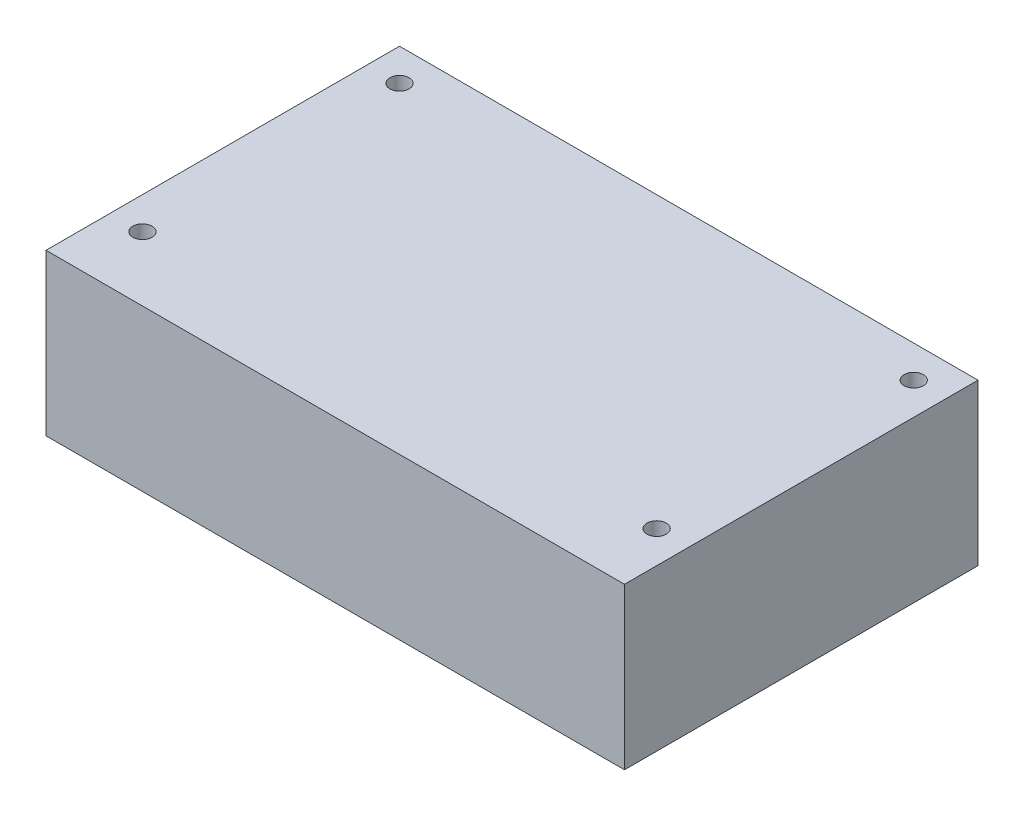
ISO-10303-21;
HEADER;
FILE_DESCRIPTION(('STEP AP214'),'2;1');
FILE_NAME('part.step','',(''),(''),'','','');
FILE_SCHEMA(('AUTOMOTIVE_DESIGN { 1 0 10303 214 1 1 1 1 }'));
ENDSEC;
DATA;
#1=APPLICATION_CONTEXT('core data for automotive mechanical design processes');
#2=APPLICATION_PROTOCOL_DEFINITION('international standard','automotive_design',2000,#1);
#3=PRODUCT_CONTEXT('',#1,'mechanical');
#4=PRODUCT('Part','Part','',(#3));
#5=PRODUCT_RELATED_PRODUCT_CATEGORY('part','',(#4));
#6=PRODUCT_DEFINITION_FORMATION('','',#4);
#7=PRODUCT_DEFINITION_CONTEXT('part definition',#1,'design');
#8=PRODUCT_DEFINITION('design','',#6,#7);
#9=PRODUCT_DEFINITION_SHAPE('','',#8);
#10=(LENGTH_UNIT() NAMED_UNIT(*) SI_UNIT(.MILLI.,.METRE.));
#11=(NAMED_UNIT(*) PLANE_ANGLE_UNIT() SI_UNIT($,.RADIAN.));
#12=(NAMED_UNIT(*) SI_UNIT($,.STERADIAN.) SOLID_ANGLE_UNIT());
#13=UNCERTAINTY_MEASURE_WITH_UNIT(LENGTH_MEASURE(1.E-05),#10,'distance_accuracy_value','');
#14=(GEOMETRIC_REPRESENTATION_CONTEXT(3) GLOBAL_UNCERTAINTY_ASSIGNED_CONTEXT((#13)) GLOBAL_UNIT_ASSIGNED_CONTEXT((#10,
#11,#12)) REPRESENTATION_CONTEXT('',''));
#15=CARTESIAN_POINT('',(0.,0.,0.));
#16=DIRECTION('',(0.,0.,1.));
#17=DIRECTION('',(1.,0.,0.));
#18=AXIS2_PLACEMENT_3D('',#15,#16,#17);
#19=CARTESIAN_POINT('',(0.,25.,0.));
#20=DIRECTION('',(0.,-1.,0.));
#21=DIRECTION('',(0.,0.,-1.));
#22=AXIS2_PLACEMENT_3D('',#19,#20,#21);
#23=PLANE('',#22);
#24=DIRECTION('',(0.,0.,-1.));
#25=VECTOR('',#24,1.);
#26=CARTESIAN_POINT('',(45.,25.,27.5));
#27=LINE('',#26,#25);
#28=CARTESIAN_POINT('',(45.,25.,27.5));
#29=VERTEX_POINT('',#28);
#30=CARTESIAN_POINT('',(45.,25.,-27.5));
#31=VERTEX_POINT('',#30);
#32=EDGE_CURVE('E96',#29,#31,#27,.T.);
#33=ORIENTED_EDGE('',*,*,#32,.T.);
#34=DIRECTION('',(-1.,0.,0.));
#35=VECTOR('',#34,1.);
#36=CARTESIAN_POINT('',(-45.,25.,-27.5));
#37=LINE('',#36,#35);
#38=CARTESIAN_POINT('',(-45.,25.,-27.5));
#39=VERTEX_POINT('',#38);
#40=EDGE_CURVE('E91',#31,#39,#37,.T.);
#41=ORIENTED_EDGE('',*,*,#40,.T.);
#42=DIRECTION('',(0.,0.,1.));
#43=VECTOR('',#42,1.);
#44=CARTESIAN_POINT('',(-45.,25.,27.5));
#45=LINE('',#44,#43);
#46=CARTESIAN_POINT('',(-45.,25.,27.5));
#47=VERTEX_POINT('',#46);
#48=EDGE_CURVE('E94',#39,#47,#45,.T.);
#49=ORIENTED_EDGE('',*,*,#48,.T.);
#50=DIRECTION('',(1.,0.,0.));
#51=VECTOR('',#50,1.);
#52=CARTESIAN_POINT('',(-45.,25.,27.5));
#53=LINE('',#52,#51);
#54=EDGE_CURVE('E61',#47,#29,#53,.T.);
#55=ORIENTED_EDGE('',*,*,#54,.T.);
#56=EDGE_LOOP('',(#33,#41,#49,#55));
#57=FACE_BOUND('',#56,.T.);
#58=CARTESIAN_POINT('',(-40.,25.,-22.5));
#59=DIRECTION('',(0.,1.,0.));
#60=DIRECTION('',(0.,0.,1.));
#61=AXIS2_PLACEMENT_3D('',#58,#59,#60);
#62=CIRCLE('',#61,1.5);
#63=CARTESIAN_POINT('',(-40.,25.,-21.));
#64=VERTEX_POINT('',#63);
#65=EDGE_CURVE('E116',#64,#64,#62,.T.);
#66=ORIENTED_EDGE('',*,*,#65,.F.);
#67=EDGE_LOOP('',(#66));
#68=FACE_BOUND('',#67,.T.);
#69=CARTESIAN_POINT('',(40.,25.,-22.5));
#70=DIRECTION('',(0.,1.,0.));
#71=DIRECTION('',(0.,0.,1.));
#72=AXIS2_PLACEMENT_3D('',#69,#70,#71);
#73=CIRCLE('',#72,1.5);
#74=CARTESIAN_POINT('',(40.,25.,-21.));
#75=VERTEX_POINT('',#74);
#76=EDGE_CURVE('E138',#75,#75,#73,.T.);
#77=ORIENTED_EDGE('',*,*,#76,.F.);
#78=EDGE_LOOP('',(#77));
#79=FACE_BOUND('',#78,.T.);
#80=CARTESIAN_POINT('',(40.,25.,17.5));
#81=DIRECTION('',(0.,1.,0.));
#82=DIRECTION('',(0.,0.,1.));
#83=AXIS2_PLACEMENT_3D('',#80,#81,#82);
#84=CIRCLE('',#83,1.5);
#85=CARTESIAN_POINT('',(40.,25.,19.));
#86=VERTEX_POINT('',#85);
#87=EDGE_CURVE('E146',#86,#86,#84,.T.);
#88=ORIENTED_EDGE('',*,*,#87,.F.);
#89=EDGE_LOOP('',(#88));
#90=FACE_BOUND('',#89,.T.);
#91=CARTESIAN_POINT('',(-40.,25.,17.5));
#92=DIRECTION('',(0.,1.,0.));
#93=DIRECTION('',(0.,0.,1.));
#94=AXIS2_PLACEMENT_3D('',#91,#92,#93);
#95=CIRCLE('',#94,1.5);
#96=CARTESIAN_POINT('',(-40.,25.,19.));
#97=VERTEX_POINT('',#96);
#98=EDGE_CURVE('E154',#97,#97,#95,.T.);
#99=ORIENTED_EDGE('',*,*,#98,.F.);
#100=EDGE_LOOP('',(#99));
#101=FACE_BOUND('',#100,.T.);
#102=ADVANCED_FACE('F43',(#57,#68,#79,#90,#101),#23,.F.);
#103=CARTESIAN_POINT('',(0.,0.,0.));
#104=DIRECTION('',(0.,-1.,0.));
#105=DIRECTION('',(0.,0.,-1.));
#106=AXIS2_PLACEMENT_3D('',#103,#104,#105);
#107=PLANE('',#106);
#108=CARTESIAN_POINT('',(40.,0.,17.5));
#109=DIRECTION('',(0.,1.,0.));
#110=DIRECTION('',(0.,0.,1.));
#111=AXIS2_PLACEMENT_3D('',#108,#109,#110);
#112=CIRCLE('',#111,1.5);
#113=CARTESIAN_POINT('',(40.,0.,19.));
#114=VERTEX_POINT('',#113);
#115=EDGE_CURVE('E150',#114,#114,#112,.T.);
#116=ORIENTED_EDGE('',*,*,#115,.T.);
#117=EDGE_LOOP('',(#116));
#118=FACE_BOUND('',#117,.T.);
#119=CARTESIAN_POINT('',(-40.,0.,-22.5));
#120=DIRECTION('',(0.,1.,0.));
#121=DIRECTION('',(0.,0.,1.));
#122=AXIS2_PLACEMENT_3D('',#119,#120,#121);
#123=CIRCLE('',#122,1.5);
#124=CARTESIAN_POINT('',(-40.,0.,-21.));
#125=VERTEX_POINT('',#124);
#126=EDGE_CURVE('E134',#125,#125,#123,.T.);
#127=ORIENTED_EDGE('',*,*,#126,.T.);
#128=EDGE_LOOP('',(#127));
#129=FACE_BOUND('',#128,.T.);
#130=DIRECTION('',(0.,0.,-1.));
#131=VECTOR('',#130,1.);
#132=CARTESIAN_POINT('',(45.,0.,27.5));
#133=LINE('',#132,#131);
#134=CARTESIAN_POINT('',(45.,0.,27.5));
#135=VERTEX_POINT('',#134);
#136=CARTESIAN_POINT('',(45.,0.,-27.5));
#137=VERTEX_POINT('',#136);
#138=EDGE_CURVE('E112',#135,#137,#133,.T.);
#139=ORIENTED_EDGE('',*,*,#138,.F.);
#140=DIRECTION('',(1.,0.,0.));
#141=VECTOR('',#140,1.);
#142=CARTESIAN_POINT('',(-45.,0.,27.5));
#143=LINE('',#142,#141);
#144=CARTESIAN_POINT('',(-45.,0.,27.5));
#145=VERTEX_POINT('',#144);
#146=EDGE_CURVE('E84',#145,#135,#143,.T.);
#147=ORIENTED_EDGE('',*,*,#146,.F.);
#148=DIRECTION('',(0.,0.,1.));
#149=VECTOR('',#148,1.);
#150=CARTESIAN_POINT('',(-45.,0.,27.5));
#151=LINE('',#150,#149);
#152=CARTESIAN_POINT('',(-45.,0.,-27.5));
#153=VERTEX_POINT('',#152);
#154=EDGE_CURVE('E78',#153,#145,#151,.T.);
#155=ORIENTED_EDGE('',*,*,#154,.F.);
#156=DIRECTION('',(-1.,0.,0.));
#157=VECTOR('',#156,1.);
#158=CARTESIAN_POINT('',(-45.,0.,-27.5));
#159=LINE('',#158,#157);
#160=EDGE_CURVE('E101',#137,#153,#159,.T.);
#161=ORIENTED_EDGE('',*,*,#160,.F.);
#162=EDGE_LOOP('',(#139,#147,#155,#161));
#163=FACE_BOUND('',#162,.T.);
#164=CARTESIAN_POINT('',(40.,0.,-22.5));
#165=DIRECTION('',(0.,1.,0.));
#166=DIRECTION('',(0.,0.,1.));
#167=AXIS2_PLACEMENT_3D('',#164,#165,#166);
#168=CIRCLE('',#167,1.5);
#169=CARTESIAN_POINT('',(40.,0.,-21.));
#170=VERTEX_POINT('',#169);
#171=EDGE_CURVE('E142',#170,#170,#168,.T.);
#172=ORIENTED_EDGE('',*,*,#171,.T.);
#173=EDGE_LOOP('',(#172));
#174=FACE_BOUND('',#173,.T.);
#175=CARTESIAN_POINT('',(-40.,0.,17.5));
#176=DIRECTION('',(0.,1.,0.));
#177=DIRECTION('',(0.,0.,1.));
#178=AXIS2_PLACEMENT_3D('',#175,#176,#177);
#179=CIRCLE('',#178,1.5);
#180=CARTESIAN_POINT('',(-40.,0.,19.));
#181=VERTEX_POINT('',#180);
#182=EDGE_CURVE('E158',#181,#181,#179,.T.);
#183=ORIENTED_EDGE('',*,*,#182,.T.);
#184=EDGE_LOOP('',(#183));
#185=FACE_BOUND('',#184,.T.);
#186=ADVANCED_FACE('F129',(#118,#129,#163,#174,#185),#107,.T.);
#187=CARTESIAN_POINT('',(45.,25.,27.5));
#188=DIRECTION('',(-1.,0.,0.));
#189=DIRECTION('',(0.,0.,1.));
#190=AXIS2_PLACEMENT_3D('',#187,#188,#189);
#191=PLANE('',#190);
#192=ORIENTED_EDGE('',*,*,#138,.T.);
#193=DIRECTION('',(0.,-1.,0.));
#194=VECTOR('',#193,1.);
#195=CARTESIAN_POINT('',(45.,25.,-27.5));
#196=LINE('',#195,#194);
#197=EDGE_CURVE('E11',#31,#137,#196,.T.);
#198=ORIENTED_EDGE('',*,*,#197,.F.);
#199=ORIENTED_EDGE('',*,*,#32,.F.);
#200=DIRECTION('',(0.,-1.,0.));
#201=VECTOR('',#200,1.);
#202=CARTESIAN_POINT('',(45.,25.,27.5));
#203=LINE('',#202,#201);
#204=EDGE_CURVE('E108',#29,#135,#203,.T.);
#205=ORIENTED_EDGE('',*,*,#204,.T.);
#206=EDGE_LOOP('',(#192,#198,#199,#205));
#207=FACE_BOUND('',#206,.T.);
#208=ADVANCED_FACE('F45',(#207),#191,.F.);
#209=CARTESIAN_POINT('',(-45.,25.,-27.5));
#210=DIRECTION('',(0.,0.,1.));
#211=DIRECTION('',(1.,0.,0.));
#212=AXIS2_PLACEMENT_3D('',#209,#210,#211);
#213=PLANE('',#212);
#214=ORIENTED_EDGE('',*,*,#160,.T.);
#215=DIRECTION('',(0.,-1.,0.));
#216=VECTOR('',#215,1.);
#217=CARTESIAN_POINT('',(-45.,25.,-27.5));
#218=LINE('',#217,#216);
#219=EDGE_CURVE('E53',#39,#153,#218,.T.);
#220=ORIENTED_EDGE('',*,*,#219,.F.);
#221=ORIENTED_EDGE('',*,*,#40,.F.);
#222=ORIENTED_EDGE('',*,*,#197,.T.);
#223=EDGE_LOOP('',(#214,#220,#221,#222));
#224=FACE_BOUND('',#223,.T.);
#225=ADVANCED_FACE('F100',(#224),#213,.F.);
#226=CARTESIAN_POINT('',(-45.,25.,27.5));
#227=DIRECTION('',(1.,0.,0.));
#228=DIRECTION('',(0.,0.,-1.));
#229=AXIS2_PLACEMENT_3D('',#226,#227,#228);
#230=PLANE('',#229);
#231=ORIENTED_EDGE('',*,*,#154,.T.);
#232=DIRECTION('',(0.,-1.,0.));
#233=VECTOR('',#232,1.);
#234=CARTESIAN_POINT('',(-45.,25.,27.5));
#235=LINE('',#234,#233);
#236=EDGE_CURVE('E103',#47,#145,#235,.T.);
#237=ORIENTED_EDGE('',*,*,#236,.F.);
#238=ORIENTED_EDGE('',*,*,#48,.F.);
#239=ORIENTED_EDGE('',*,*,#219,.T.);
#240=EDGE_LOOP('',(#231,#237,#238,#239));
#241=FACE_BOUND('',#240,.T.);
#242=ADVANCED_FACE('F104',(#241),#230,.F.);
#243=CARTESIAN_POINT('',(-45.,25.,27.5));
#244=DIRECTION('',(0.,0.,-1.));
#245=DIRECTION('',(-1.,0.,0.));
#246=AXIS2_PLACEMENT_3D('',#243,#244,#245);
#247=PLANE('',#246);
#248=ORIENTED_EDGE('',*,*,#146,.T.);
#249=ORIENTED_EDGE('',*,*,#204,.F.);
#250=ORIENTED_EDGE('',*,*,#54,.F.);
#251=ORIENTED_EDGE('',*,*,#236,.T.);
#252=EDGE_LOOP('',(#248,#249,#250,#251));
#253=FACE_BOUND('',#252,.T.);
#254=ADVANCED_FACE('F126',(#253),#247,.F.);
#255=CARTESIAN_POINT('',(-40.,25.,-22.5));
#256=DIRECTION('',(0.,-1.,0.));
#257=DIRECTION('',(0.,0.,-1.));
#258=AXIS2_PLACEMENT_3D('',#255,#256,#257);
#259=CYLINDRICAL_SURFACE('',#258,1.5);
#260=ORIENTED_EDGE('',*,*,#65,.T.);
#261=EDGE_LOOP('',(#260));
#262=FACE_BOUND('',#261,.T.);
#263=ORIENTED_EDGE('',*,*,#126,.F.);
#264=EDGE_LOOP('',(#263));
#265=FACE_BOUND('',#264,.T.);
#266=ADVANCED_FACE('F177',(#262,#265),#259,.F.);
#267=CARTESIAN_POINT('',(40.,25.,-22.5));
#268=DIRECTION('',(0.,-1.,0.));
#269=DIRECTION('',(0.,0.,-1.));
#270=AXIS2_PLACEMENT_3D('',#267,#268,#269);
#271=CYLINDRICAL_SURFACE('',#270,1.5);
#272=ORIENTED_EDGE('',*,*,#76,.T.);
#273=EDGE_LOOP('',(#272));
#274=FACE_BOUND('',#273,.T.);
#275=ORIENTED_EDGE('',*,*,#171,.F.);
#276=EDGE_LOOP('',(#275));
#277=FACE_BOUND('',#276,.T.);
#278=ADVANCED_FACE('F231',(#274,#277),#271,.F.);
#279=CARTESIAN_POINT('',(40.,25.,17.5));
#280=DIRECTION('',(0.,-1.,0.));
#281=DIRECTION('',(0.,0.,-1.));
#282=AXIS2_PLACEMENT_3D('',#279,#280,#281);
#283=CYLINDRICAL_SURFACE('',#282,1.5);
#284=ORIENTED_EDGE('',*,*,#87,.T.);
#285=EDGE_LOOP('',(#284));
#286=FACE_BOUND('',#285,.T.);
#287=ORIENTED_EDGE('',*,*,#115,.F.);
#288=EDGE_LOOP('',(#287));
#289=FACE_BOUND('',#288,.T.);
#290=ADVANCED_FACE('F240',(#286,#289),#283,.F.);
#291=CARTESIAN_POINT('',(-40.,25.,17.5));
#292=DIRECTION('',(0.,-1.,0.));
#293=DIRECTION('',(0.,0.,-1.));
#294=AXIS2_PLACEMENT_3D('',#291,#292,#293);
#295=CYLINDRICAL_SURFACE('',#294,1.5);
#296=ORIENTED_EDGE('',*,*,#98,.T.);
#297=EDGE_LOOP('',(#296));
#298=FACE_BOUND('',#297,.T.);
#299=ORIENTED_EDGE('',*,*,#182,.F.);
#300=EDGE_LOOP('',(#299));
#301=FACE_BOUND('',#300,.T.);
#302=ADVANCED_FACE('F166',(#298,#301),#295,.F.);
#303=CLOSED_SHELL('',(#102,#186,#208,#225,#242,#254,#266,#278,#290,#302));
#304=MANIFOLD_SOLID_BREP('B2',#303);
#305=ADVANCED_BREP_SHAPE_REPRESENTATION('',(#18,#304),#14);
#306=SHAPE_DEFINITION_REPRESENTATION(#9,#305);
ENDSEC;
END-ISO-10303-21;
